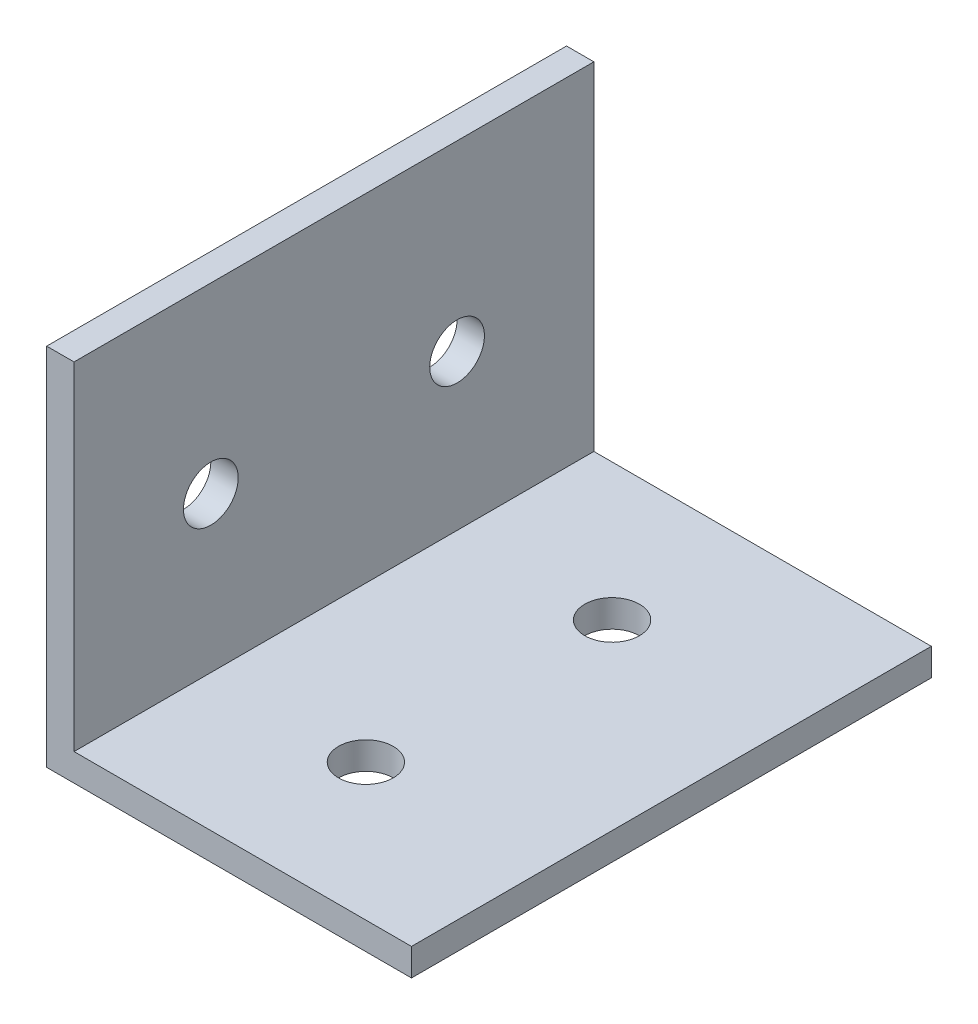
ISO-10303-21;
HEADER;
FILE_DESCRIPTION(('STEP AP214'),'2;1');
FILE_NAME('part.step','',(''),(''),'','','');
FILE_SCHEMA(('AUTOMOTIVE_DESIGN { 1 0 10303 214 1 1 1 1 }'));
ENDSEC;
DATA;
#1=APPLICATION_CONTEXT('core data for automotive mechanical design processes');
#2=APPLICATION_PROTOCOL_DEFINITION('international standard','automotive_design',2000,#1);
#3=PRODUCT_CONTEXT('',#1,'mechanical');
#4=PRODUCT('Part','Part','',(#3));
#5=PRODUCT_RELATED_PRODUCT_CATEGORY('part','',(#4));
#6=PRODUCT_DEFINITION_FORMATION('','',#4);
#7=PRODUCT_DEFINITION_CONTEXT('part definition',#1,'design');
#8=PRODUCT_DEFINITION('design','',#6,#7);
#9=PRODUCT_DEFINITION_SHAPE('','',#8);
#10=(LENGTH_UNIT() NAMED_UNIT(*) SI_UNIT(.MILLI.,.METRE.));
#11=(NAMED_UNIT(*) PLANE_ANGLE_UNIT() SI_UNIT($,.RADIAN.));
#12=(NAMED_UNIT(*) SI_UNIT($,.STERADIAN.) SOLID_ANGLE_UNIT());
#13=UNCERTAINTY_MEASURE_WITH_UNIT(LENGTH_MEASURE(1.E-05),#10,'distance_accuracy_value','');
#14=(GEOMETRIC_REPRESENTATION_CONTEXT(3) GLOBAL_UNCERTAINTY_ASSIGNED_CONTEXT((#13)) GLOBAL_UNIT_ASSIGNED_CONTEXT((#10,
#11,#12)) REPRESENTATION_CONTEXT('',''));
#15=CARTESIAN_POINT('',(0.,0.,0.));
#16=DIRECTION('',(0.,0.,1.));
#17=DIRECTION('',(1.,0.,0.));
#18=AXIS2_PLACEMENT_3D('',#15,#16,#17);
#19=CARTESIAN_POINT('',(-15.4771600640463,3.86431578947368,28.5));
#20=DIRECTION('',(0.,-1.,0.));
#21=DIRECTION('',(1.,0.,0.));
#22=AXIS2_PLACEMENT_3D('',#19,#20,#21);
#23=PLANE('',#22);
#24=DIRECTION('',(-1.,0.,0.));
#25=VECTOR('',#24,1.);
#26=CARTESIAN_POINT('',(-15.4771600640463,3.86431578947368,0.));
#27=LINE('',#26,#25);
#28=CARTESIAN_POINT('',(-15.4771600640463,3.86431578947368,0.));
#29=VERTEX_POINT('',#28);
#30=CARTESIAN_POINT('',(-16.9771600640463,3.86431578947368,0.));
#31=VERTEX_POINT('',#30);
#32=EDGE_CURVE('E117',#29,#31,#27,.T.);
#33=ORIENTED_EDGE('',*,*,#32,.T.);
#34=DIRECTION('',(0.,0.,-1.));
#35=VECTOR('',#34,1.);
#36=CARTESIAN_POINT('',(-16.9771600640463,3.86431578947368,28.5));
#37=LINE('',#36,#35);
#38=CARTESIAN_POINT('',(-16.9771600640463,3.86431578947368,28.5));
#39=VERTEX_POINT('',#38);
#40=EDGE_CURVE('E11',#39,#31,#37,.T.);
#41=ORIENTED_EDGE('',*,*,#40,.F.);
#42=DIRECTION('',(-1.,0.,0.));
#43=VECTOR('',#42,1.);
#44=CARTESIAN_POINT('',(-15.4771600640463,3.86431578947368,28.5));
#45=LINE('',#44,#43);
#46=CARTESIAN_POINT('',(-15.4771600640463,3.86431578947368,28.5));
#47=VERTEX_POINT('',#46);
#48=EDGE_CURVE('E128',#47,#39,#45,.T.);
#49=ORIENTED_EDGE('',*,*,#48,.F.);
#50=DIRECTION('',(0.,0.,-1.));
#51=VECTOR('',#50,1.);
#52=CARTESIAN_POINT('',(-15.4771600640463,3.86431578947368,28.5));
#53=LINE('',#52,#51);
#54=EDGE_CURVE('E113',#47,#29,#53,.T.);
#55=ORIENTED_EDGE('',*,*,#54,.T.);
#56=EDGE_LOOP('',(#33,#41,#49,#55));
#57=FACE_BOUND('',#56,.T.);
#58=ADVANCED_FACE('F31',(#57),#23,.F.);
#59=CARTESIAN_POINT('',(-16.9771600640463,3.86431578947368,28.5));
#60=DIRECTION('',(1.,0.,0.));
#61=DIRECTION('',(0.,1.,0.));
#62=AXIS2_PLACEMENT_3D('',#59,#60,#61);
#63=PLANE('',#62);
#64=CARTESIAN_POINT('',(-16.9771600640463,-6.13568421052632,7.5));
#65=DIRECTION('',(-1.,0.,0.));
#66=DIRECTION('',(0.,-1.,0.));
#67=AXIS2_PLACEMENT_3D('',#64,#65,#66);
#68=CIRCLE('',#67,1.5);
#69=CARTESIAN_POINT('',(-16.9771600640463,-7.63568421052632,7.5));
#70=VERTEX_POINT('',#69);
#71=EDGE_CURVE('E139',#70,#70,#68,.T.);
#72=ORIENTED_EDGE('',*,*,#71,.F.);
#73=EDGE_LOOP('',(#72));
#74=FACE_BOUND('',#73,.T.);
#75=CARTESIAN_POINT('',(-16.9771600640463,-6.13568421052632,21.));
#76=DIRECTION('',(-1.,0.,0.));
#77=DIRECTION('',(0.,-1.,0.));
#78=AXIS2_PLACEMENT_3D('',#75,#76,#77);
#79=CIRCLE('',#78,1.5);
#80=CARTESIAN_POINT('',(-16.9771600640463,-7.63568421052632,21.));
#81=VERTEX_POINT('',#80);
#82=EDGE_CURVE('E136',#81,#81,#79,.T.);
#83=ORIENTED_EDGE('',*,*,#82,.F.);
#84=EDGE_LOOP('',(#83));
#85=FACE_BOUND('',#84,.T.);
#86=DIRECTION('',(0.,-1.,0.));
#87=VECTOR('',#86,1.);
#88=CARTESIAN_POINT('',(-16.9771600640463,3.86431578947368,0.));
#89=LINE('',#88,#87);
#90=CARTESIAN_POINT('',(-16.9771600640463,-16.1356842105263,0.));
#91=VERTEX_POINT('',#90);
#92=EDGE_CURVE('E120',#31,#91,#89,.T.);
#93=ORIENTED_EDGE('',*,*,#92,.T.);
#94=DIRECTION('',(0.,0.,-1.));
#95=VECTOR('',#94,1.);
#96=CARTESIAN_POINT('',(-16.9771600640463,-16.1356842105263,28.5));
#97=LINE('',#96,#95);
#98=CARTESIAN_POINT('',(-16.9771600640463,-16.1356842105263,28.5));
#99=VERTEX_POINT('',#98);
#100=EDGE_CURVE('E40',#99,#91,#97,.T.);
#101=ORIENTED_EDGE('',*,*,#100,.F.);
#102=DIRECTION('',(0.,-1.,0.));
#103=VECTOR('',#102,1.);
#104=CARTESIAN_POINT('',(-16.9771600640463,3.86431578947368,28.5));
#105=LINE('',#104,#103);
#106=EDGE_CURVE('E86',#39,#99,#105,.T.);
#107=ORIENTED_EDGE('',*,*,#106,.F.);
#108=ORIENTED_EDGE('',*,*,#40,.T.);
#109=EDGE_LOOP('',(#93,#101,#107,#108));
#110=FACE_BOUND('',#109,.T.);
#111=ADVANCED_FACE('F160',(#74,#85,#110),#63,.F.);
#112=CARTESIAN_POINT('',(-16.9771600640463,-16.1356842105263,28.5));
#113=DIRECTION('',(0.,1.,0.));
#114=DIRECTION('',(0.,0.,1.));
#115=AXIS2_PLACEMENT_3D('',#112,#113,#114);
#116=PLANE('',#115);
#117=CARTESIAN_POINT('',(-6.97716006404626,-16.1356842105263,21.));
#118=DIRECTION('',(0.,-1.,0.));
#119=DIRECTION('',(0.,0.,-1.));
#120=AXIS2_PLACEMENT_3D('',#117,#118,#119);
#121=CIRCLE('',#120,1.5);
#122=CARTESIAN_POINT('',(-6.97716006404626,-16.1356842105263,19.5));
#123=VERTEX_POINT('',#122);
#124=EDGE_CURVE('E152',#123,#123,#121,.T.);
#125=ORIENTED_EDGE('',*,*,#124,.F.);
#126=EDGE_LOOP('',(#125));
#127=FACE_BOUND('',#126,.T.);
#128=CARTESIAN_POINT('',(-6.97716006404626,-16.1356842105263,7.5));
#129=DIRECTION('',(0.,-1.,0.));
#130=DIRECTION('',(0.,0.,-1.));
#131=AXIS2_PLACEMENT_3D('',#128,#129,#130);
#132=CIRCLE('',#131,1.5);
#133=CARTESIAN_POINT('',(-6.97716006404626,-16.1356842105263,6.));
#134=VERTEX_POINT('',#133);
#135=EDGE_CURVE('E142',#134,#134,#132,.T.);
#136=ORIENTED_EDGE('',*,*,#135,.F.);
#137=EDGE_LOOP('',(#136));
#138=FACE_BOUND('',#137,.T.);
#139=DIRECTION('',(1.,0.,0.));
#140=VECTOR('',#139,1.);
#141=CARTESIAN_POINT('',(-16.9771600640463,-16.1356842105263,0.));
#142=LINE('',#141,#140);
#143=CARTESIAN_POINT('',(3.02283993595374,-16.1356842105263,0.));
#144=VERTEX_POINT('',#143);
#145=EDGE_CURVE('E123',#91,#144,#142,.T.);
#146=ORIENTED_EDGE('',*,*,#145,.T.);
#147=DIRECTION('',(0.,0.,-1.));
#148=VECTOR('',#147,1.);
#149=CARTESIAN_POINT('',(3.02283993595374,-16.1356842105263,28.5));
#150=LINE('',#149,#148);
#151=CARTESIAN_POINT('',(3.02283993595374,-16.1356842105263,28.5));
#152=VERTEX_POINT('',#151);
#153=EDGE_CURVE('E108',#152,#144,#150,.T.);
#154=ORIENTED_EDGE('',*,*,#153,.F.);
#155=DIRECTION('',(1.,0.,0.));
#156=VECTOR('',#155,1.);
#157=CARTESIAN_POINT('',(-16.9771600640463,-16.1356842105263,28.5));
#158=LINE('',#157,#156);
#159=EDGE_CURVE('E99',#99,#152,#158,.T.);
#160=ORIENTED_EDGE('',*,*,#159,.F.);
#161=ORIENTED_EDGE('',*,*,#100,.T.);
#162=EDGE_LOOP('',(#146,#154,#160,#161));
#163=FACE_BOUND('',#162,.T.);
#164=ADVANCED_FACE('F163',(#127,#138,#163),#116,.F.);
#165=CARTESIAN_POINT('',(3.02283993595374,-16.1356842105263,28.5));
#166=DIRECTION('',(-1.,0.,0.));
#167=DIRECTION('',(0.,0.,1.));
#168=AXIS2_PLACEMENT_3D('',#165,#166,#167);
#169=PLANE('',#168);
#170=DIRECTION('',(0.,1.,0.));
#171=VECTOR('',#170,1.);
#172=CARTESIAN_POINT('',(3.02283993595374,-16.1356842105263,0.));
#173=LINE('',#172,#171);
#174=CARTESIAN_POINT('',(3.02283993595374,-14.6356842105263,0.));
#175=VERTEX_POINT('',#174);
#176=EDGE_CURVE('E107',#144,#175,#173,.T.);
#177=ORIENTED_EDGE('',*,*,#176,.T.);
#178=DIRECTION('',(0.,0.,-1.));
#179=VECTOR('',#178,1.);
#180=CARTESIAN_POINT('',(3.02283993595374,-14.6356842105263,28.5));
#181=LINE('',#180,#179);
#182=CARTESIAN_POINT('',(3.02283993595374,-14.6356842105263,28.5));
#183=VERTEX_POINT('',#182);
#184=EDGE_CURVE('E104',#183,#175,#181,.T.);
#185=ORIENTED_EDGE('',*,*,#184,.F.);
#186=DIRECTION('',(0.,1.,0.));
#187=VECTOR('',#186,1.);
#188=CARTESIAN_POINT('',(3.02283993595374,-16.1356842105263,28.5));
#189=LINE('',#188,#187);
#190=EDGE_CURVE('E93',#152,#183,#189,.T.);
#191=ORIENTED_EDGE('',*,*,#190,.F.);
#192=ORIENTED_EDGE('',*,*,#153,.T.);
#193=EDGE_LOOP('',(#177,#185,#191,#192));
#194=FACE_BOUND('',#193,.T.);
#195=ADVANCED_FACE('F105',(#194),#169,.F.);
#196=CARTESIAN_POINT('',(3.02283993595374,-14.6356842105263,28.5));
#197=DIRECTION('',(0.,-1.,0.));
#198=DIRECTION('',(1.,0.,0.));
#199=AXIS2_PLACEMENT_3D('',#196,#197,#198);
#200=PLANE('',#199);
#201=CARTESIAN_POINT('',(-6.97716006404626,-14.6356842105263,21.));
#202=DIRECTION('',(0.,-1.,0.));
#203=DIRECTION('',(1.,0.,0.));
#204=AXIS2_PLACEMENT_3D('',#201,#202,#203);
#205=CIRCLE('',#204,1.5);
#206=CARTESIAN_POINT('',(-5.47716006404626,-14.6356842105263,21.));
#207=VERTEX_POINT('',#206);
#208=EDGE_CURVE('E34',#207,#207,#205,.T.);
#209=ORIENTED_EDGE('',*,*,#208,.T.);
#210=EDGE_LOOP('',(#209));
#211=FACE_BOUND('',#210,.T.);
#212=CARTESIAN_POINT('',(-6.97716006404626,-14.6356842105263,7.5));
#213=DIRECTION('',(0.,-1.,0.));
#214=DIRECTION('',(1.,0.,0.));
#215=AXIS2_PLACEMENT_3D('',#212,#213,#214);
#216=CIRCLE('',#215,1.5);
#217=CARTESIAN_POINT('',(-5.47716006404626,-14.6356842105263,7.5));
#218=VERTEX_POINT('',#217);
#219=EDGE_CURVE('E140',#218,#218,#216,.T.);
#220=ORIENTED_EDGE('',*,*,#219,.T.);
#221=EDGE_LOOP('',(#220));
#222=FACE_BOUND('',#221,.T.);
#223=DIRECTION('',(-1.,0.,0.));
#224=VECTOR('',#223,1.);
#225=CARTESIAN_POINT('',(3.02283993595374,-14.6356842105263,0.));
#226=LINE('',#225,#224);
#227=CARTESIAN_POINT('',(-15.4771600640463,-14.6356842105263,0.));
#228=VERTEX_POINT('',#227);
#229=EDGE_CURVE('E72',#175,#228,#226,.T.);
#230=ORIENTED_EDGE('',*,*,#229,.T.);
#231=DIRECTION('',(0.,0.,-1.));
#232=VECTOR('',#231,1.);
#233=CARTESIAN_POINT('',(-15.4771600640463,-14.6356842105263,28.5));
#234=LINE('',#233,#232);
#235=CARTESIAN_POINT('',(-15.4771600640463,-14.6356842105263,28.5));
#236=VERTEX_POINT('',#235);
#237=EDGE_CURVE('E109',#236,#228,#234,.T.);
#238=ORIENTED_EDGE('',*,*,#237,.F.);
#239=DIRECTION('',(-1.,0.,0.));
#240=VECTOR('',#239,1.);
#241=CARTESIAN_POINT('',(3.02283993595374,-14.6356842105263,28.5));
#242=LINE('',#241,#240);
#243=EDGE_CURVE('E97',#183,#236,#242,.T.);
#244=ORIENTED_EDGE('',*,*,#243,.F.);
#245=ORIENTED_EDGE('',*,*,#184,.T.);
#246=EDGE_LOOP('',(#230,#238,#244,#245));
#247=FACE_BOUND('',#246,.T.);
#248=ADVANCED_FACE('F111',(#211,#222,#247),#200,.F.);
#249=CARTESIAN_POINT('',(-15.4771600640463,-14.6356842105263,28.5));
#250=DIRECTION('',(-1.,0.,0.));
#251=DIRECTION('',(0.,-1.,0.));
#252=AXIS2_PLACEMENT_3D('',#249,#250,#251);
#253=PLANE('',#252);
#254=CARTESIAN_POINT('',(-15.4771600640463,-6.13568421052632,7.5));
#255=DIRECTION('',(-1.,0.,0.));
#256=DIRECTION('',(0.,-1.,0.));
#257=AXIS2_PLACEMENT_3D('',#254,#255,#256);
#258=CIRCLE('',#257,1.5);
#259=CARTESIAN_POINT('',(-15.4771600640463,-7.63568421052632,7.5));
#260=VERTEX_POINT('',#259);
#261=EDGE_CURVE('E137',#260,#260,#258,.T.);
#262=ORIENTED_EDGE('',*,*,#261,.T.);
#263=EDGE_LOOP('',(#262));
#264=FACE_BOUND('',#263,.T.);
#265=CARTESIAN_POINT('',(-15.4771600640463,-6.13568421052632,21.));
#266=DIRECTION('',(-1.,0.,0.));
#267=DIRECTION('',(0.,-1.,0.));
#268=AXIS2_PLACEMENT_3D('',#265,#266,#267);
#269=CIRCLE('',#268,1.5);
#270=CARTESIAN_POINT('',(-15.4771600640463,-7.63568421052632,21.));
#271=VERTEX_POINT('',#270);
#272=EDGE_CURVE('E121',#271,#271,#269,.T.);
#273=ORIENTED_EDGE('',*,*,#272,.T.);
#274=EDGE_LOOP('',(#273));
#275=FACE_BOUND('',#274,.T.);
#276=DIRECTION('',(0.,1.,0.));
#277=VECTOR('',#276,1.);
#278=CARTESIAN_POINT('',(-15.4771600640463,-14.6356842105263,0.));
#279=LINE('',#278,#277);
#280=EDGE_CURVE('E78',#228,#29,#279,.T.);
#281=ORIENTED_EDGE('',*,*,#280,.T.);
#282=ORIENTED_EDGE('',*,*,#54,.F.);
#283=DIRECTION('',(0.,1.,0.));
#284=VECTOR('',#283,1.);
#285=CARTESIAN_POINT('',(-15.4771600640463,-14.6356842105263,28.5));
#286=LINE('',#285,#284);
#287=EDGE_CURVE('E49',#236,#47,#286,.T.);
#288=ORIENTED_EDGE('',*,*,#287,.F.);
#289=ORIENTED_EDGE('',*,*,#237,.T.);
#290=EDGE_LOOP('',(#281,#282,#288,#289));
#291=FACE_BOUND('',#290,.T.);
#292=ADVANCED_FACE('F168',(#264,#275,#291),#253,.F.);
#293=CARTESIAN_POINT('',(-16.9771600640463,3.86431578947368,28.5));
#294=DIRECTION('',(0.,0.,1.));
#295=DIRECTION('',(1.,0.,0.));
#296=AXIS2_PLACEMENT_3D('',#293,#294,#295);
#297=PLANE('',#296);
#298=ORIENTED_EDGE('',*,*,#48,.T.);
#299=ORIENTED_EDGE('',*,*,#106,.T.);
#300=ORIENTED_EDGE('',*,*,#159,.T.);
#301=ORIENTED_EDGE('',*,*,#190,.T.);
#302=ORIENTED_EDGE('',*,*,#243,.T.);
#303=ORIENTED_EDGE('',*,*,#287,.T.);
#304=EDGE_LOOP('',(#298,#299,#300,#301,#302,#303));
#305=FACE_BOUND('',#304,.T.);
#306=ADVANCED_FACE('F95',(#305),#297,.T.);
#307=CARTESIAN_POINT('',(-16.9771600640463,3.86431578947368,0.));
#308=DIRECTION('',(0.,0.,1.));
#309=DIRECTION('',(1.,0.,0.));
#310=AXIS2_PLACEMENT_3D('',#307,#308,#309);
#311=PLANE('',#310);
#312=ORIENTED_EDGE('',*,*,#32,.F.);
#313=ORIENTED_EDGE('',*,*,#280,.F.);
#314=ORIENTED_EDGE('',*,*,#229,.F.);
#315=ORIENTED_EDGE('',*,*,#176,.F.);
#316=ORIENTED_EDGE('',*,*,#145,.F.);
#317=ORIENTED_EDGE('',*,*,#92,.F.);
#318=EDGE_LOOP('',(#312,#313,#314,#315,#316,#317));
#319=FACE_BOUND('',#318,.T.);
#320=ADVANCED_FACE('F166',(#319),#311,.F.);
#321=CARTESIAN_POINT('',(30.5228399359537,-6.1356842105263,21.));
#322=DIRECTION('',(-1.,0.,0.));
#323=DIRECTION('',(0.,-1.,0.));
#324=AXIS2_PLACEMENT_3D('',#321,#322,#323);
#325=CYLINDRICAL_SURFACE('',#324,1.5);
#326=ORIENTED_EDGE('',*,*,#82,.T.);
#327=EDGE_LOOP('',(#326));
#328=FACE_BOUND('',#327,.T.);
#329=ORIENTED_EDGE('',*,*,#272,.F.);
#330=EDGE_LOOP('',(#329));
#331=FACE_BOUND('',#330,.T.);
#332=ADVANCED_FACE('F238',(#328,#331),#325,.F.);
#333=CARTESIAN_POINT('',(30.5228399359537,-6.13568421052631,7.5));
#334=DIRECTION('',(-1.,0.,0.));
#335=DIRECTION('',(0.,-1.,0.));
#336=AXIS2_PLACEMENT_3D('',#333,#334,#335);
#337=CYLINDRICAL_SURFACE('',#336,1.5);
#338=ORIENTED_EDGE('',*,*,#71,.T.);
#339=EDGE_LOOP('',(#338));
#340=FACE_BOUND('',#339,.T.);
#341=ORIENTED_EDGE('',*,*,#261,.F.);
#342=EDGE_LOOP('',(#341));
#343=FACE_BOUND('',#342,.T.);
#344=ADVANCED_FACE('F219',(#340,#343),#337,.F.);
#345=CARTESIAN_POINT('',(-6.97716006404626,-6.13568421052632,7.5));
#346=DIRECTION('',(0.,-1.,0.));
#347=DIRECTION('',(0.,0.,-1.));
#348=AXIS2_PLACEMENT_3D('',#345,#346,#347);
#349=CYLINDRICAL_SURFACE('',#348,1.5);
#350=ORIENTED_EDGE('',*,*,#135,.T.);
#351=EDGE_LOOP('',(#350));
#352=FACE_BOUND('',#351,.T.);
#353=ORIENTED_EDGE('',*,*,#219,.F.);
#354=EDGE_LOOP('',(#353));
#355=FACE_BOUND('',#354,.T.);
#356=ADVANCED_FACE('F213',(#352,#355),#349,.F.);
#357=CARTESIAN_POINT('',(-6.97716006404626,-6.13568421052632,21.));
#358=DIRECTION('',(0.,-1.,0.));
#359=DIRECTION('',(0.,0.,-1.));
#360=AXIS2_PLACEMENT_3D('',#357,#358,#359);
#361=CYLINDRICAL_SURFACE('',#360,1.5);
#362=ORIENTED_EDGE('',*,*,#124,.T.);
#363=EDGE_LOOP('',(#362));
#364=FACE_BOUND('',#363,.T.);
#365=ORIENTED_EDGE('',*,*,#208,.F.);
#366=EDGE_LOOP('',(#365));
#367=FACE_BOUND('',#366,.T.);
#368=ADVANCED_FACE('F218',(#364,#367),#361,.F.);
#369=CLOSED_SHELL('',(#58,#111,#164,#195,#248,#292,#306,#320,#332,#344,#356,#368));
#370=MANIFOLD_SOLID_BREP('B2',#369);
#371=ADVANCED_BREP_SHAPE_REPRESENTATION('',(#18,#370),#14);
#372=SHAPE_DEFINITION_REPRESENTATION(#9,#371);
ENDSEC;
END-ISO-10303-21;
